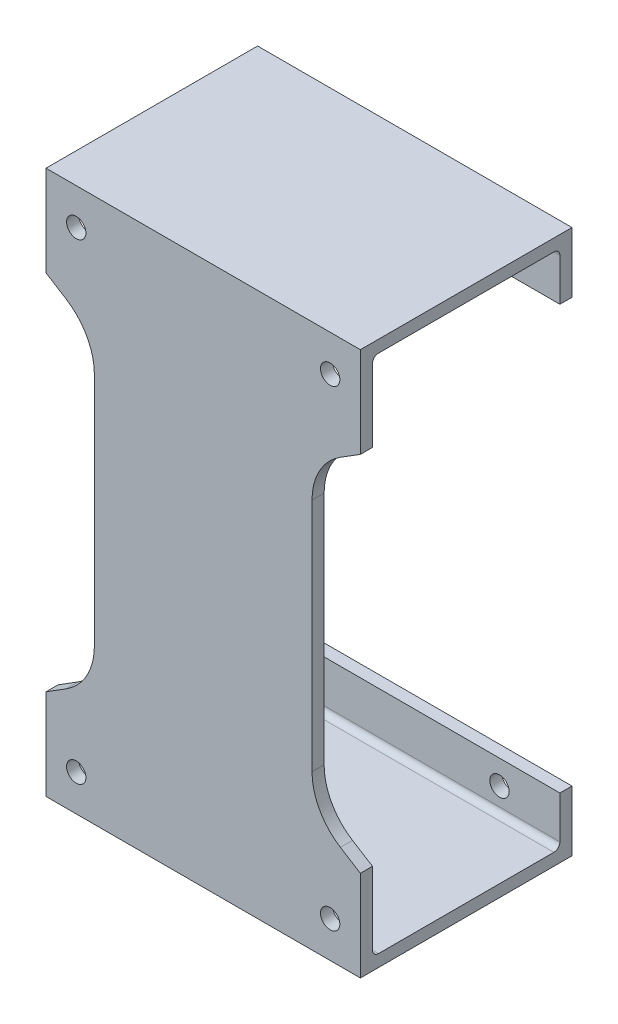
ISO-10303-21;
HEADER;
FILE_DESCRIPTION(('STEP AP214'),'2;1');
FILE_NAME('part.step','',(''),(''),'','','');
FILE_SCHEMA(('AUTOMOTIVE_DESIGN { 1 0 10303 214 1 1 1 1 }'));
ENDSEC;
DATA;
#1=APPLICATION_CONTEXT('core data for automotive mechanical design processes');
#2=APPLICATION_PROTOCOL_DEFINITION('international standard','automotive_design',2000,#1);
#3=PRODUCT_CONTEXT('',#1,'mechanical');
#4=PRODUCT('Part','Part','',(#3));
#5=PRODUCT_RELATED_PRODUCT_CATEGORY('part','',(#4));
#6=PRODUCT_DEFINITION_FORMATION('','',#4);
#7=PRODUCT_DEFINITION_CONTEXT('part definition',#1,'design');
#8=PRODUCT_DEFINITION('design','',#6,#7);
#9=PRODUCT_DEFINITION_SHAPE('','',#8);
#10=(LENGTH_UNIT() NAMED_UNIT(*) SI_UNIT(.MILLI.,.METRE.));
#11=(NAMED_UNIT(*) PLANE_ANGLE_UNIT() SI_UNIT($,.RADIAN.));
#12=(NAMED_UNIT(*) SI_UNIT($,.STERADIAN.) SOLID_ANGLE_UNIT());
#13=UNCERTAINTY_MEASURE_WITH_UNIT(LENGTH_MEASURE(1.E-05),#10,'distance_accuracy_value','');
#14=(GEOMETRIC_REPRESENTATION_CONTEXT(3) GLOBAL_UNCERTAINTY_ASSIGNED_CONTEXT((#13)) GLOBAL_UNIT_ASSIGNED_CONTEXT((#10,
#11,#12)) REPRESENTATION_CONTEXT('',''));
#15=CARTESIAN_POINT('',(0.,0.,0.));
#16=DIRECTION('',(0.,0.,1.));
#17=DIRECTION('',(1.,0.,0.));
#18=AXIS2_PLACEMENT_3D('',#15,#16,#17);
#19=CARTESIAN_POINT('',(26.,0.,0.));
#20=DIRECTION('',(1.,0.,0.));
#21=DIRECTION('',(0.,0.,-1.));
#22=AXIS2_PLACEMENT_3D('',#19,#20,#21);
#23=PLANE('',#22);
#24=DIRECTION('',(0.,0.,1.));
#25=VECTOR('',#24,1.);
#26=CARTESIAN_POINT('',(26.,-29.9999999999999,-35.001));
#27=LINE('',#26,#25);
#28=CARTESIAN_POINT('',(26.,-29.9999999999999,-2.));
#29=VERTEX_POINT('',#28);
#30=CARTESIAN_POINT('',(26.,-29.9999999999999,0.));
#31=VERTEX_POINT('',#30);
#32=EDGE_CURVE('E228',#29,#31,#27,.T.);
#33=ORIENTED_EDGE('',*,*,#32,.T.);
#34=DIRECTION('',(0.,-1.,0.));
#35=VECTOR('',#34,1.);
#36=CARTESIAN_POINT('',(26.,-45.,0.));
#37=LINE('',#36,#35);
#38=CARTESIAN_POINT('',(26.,-45.,0.));
#39=VERTEX_POINT('',#38);
#40=EDGE_CURVE('E247',#31,#39,#37,.T.);
#41=ORIENTED_EDGE('',*,*,#40,.T.);
#42=DIRECTION('',(0.,0.,-1.));
#43=VECTOR('',#42,1.);
#44=CARTESIAN_POINT('',(26.,-45.,0.));
#45=LINE('',#44,#43);
#46=CARTESIAN_POINT('',(26.,-45.,-35.));
#47=VERTEX_POINT('',#46);
#48=EDGE_CURVE('E287',#39,#47,#45,.T.);
#49=ORIENTED_EDGE('',*,*,#48,.T.);
#50=DIRECTION('',(0.,1.,0.));
#51=VECTOR('',#50,1.);
#52=CARTESIAN_POINT('',(26.,-45.,-35.));
#53=LINE('',#52,#51);
#54=CARTESIAN_POINT('',(26.,-35.,-35.));
#55=VERTEX_POINT('',#54);
#56=EDGE_CURVE('E454',#47,#55,#53,.T.);
#57=ORIENTED_EDGE('',*,*,#56,.T.);
#58=DIRECTION('',(0.,0.,1.));
#59=VECTOR('',#58,1.);
#60=CARTESIAN_POINT('',(26.,-35.,-33.));
#61=LINE('',#60,#59);
#62=CARTESIAN_POINT('',(26.,-35.,-33.));
#63=VERTEX_POINT('',#62);
#64=EDGE_CURVE('E456',#55,#63,#61,.T.);
#65=ORIENTED_EDGE('',*,*,#64,.T.);
#66=DIRECTION('',(0.,-1.,0.));
#67=VECTOR('',#66,1.);
#68=CARTESIAN_POINT('',(26.,-43.,-33.));
#69=LINE('',#68,#67);
#70=CARTESIAN_POINT('',(26.,-42.,-33.));
#71=VERTEX_POINT('',#70);
#72=EDGE_CURVE('E458',#63,#71,#69,.T.);
#73=ORIENTED_EDGE('',*,*,#72,.T.);
#74=CARTESIAN_POINT('',(26.,-42.,-32.));
#75=DIRECTION('',(1.,0.,0.));
#76=DIRECTION('',(0.,0.,-1.));
#77=AXIS2_PLACEMENT_3D('',#74,#75,#76);
#78=CIRCLE('',#77,1.);
#79=CARTESIAN_POINT('',(26.,-43.,-32.));
#80=VERTEX_POINT('',#79);
#81=EDGE_CURVE('E331',#71,#80,#78,.F.);
#82=ORIENTED_EDGE('',*,*,#81,.T.);
#83=DIRECTION('',(0.,0.,1.));
#84=VECTOR('',#83,1.);
#85=CARTESIAN_POINT('',(26.,-43.,-2.));
#86=LINE('',#85,#84);
#87=CARTESIAN_POINT('',(26.,-43.,-3.));
#88=VERTEX_POINT('',#87);
#89=EDGE_CURVE('E461',#80,#88,#86,.T.);
#90=ORIENTED_EDGE('',*,*,#89,.T.);
#91=CARTESIAN_POINT('',(26.,-42.,-3.));
#92=DIRECTION('',(1.,0.,0.));
#93=DIRECTION('',(0.,0.,-1.));
#94=AXIS2_PLACEMENT_3D('',#91,#92,#93);
#95=CIRCLE('',#94,1.);
#96=CARTESIAN_POINT('',(26.,-42.,-2.));
#97=VERTEX_POINT('',#96);
#98=EDGE_CURVE('E339',#88,#97,#95,.F.);
#99=ORIENTED_EDGE('',*,*,#98,.T.);
#100=DIRECTION('',(0.,1.,0.));
#101=VECTOR('',#100,1.);
#102=CARTESIAN_POINT('',(26.,-43.,-2.));
#103=LINE('',#102,#101);
#104=EDGE_CURVE('E465',#97,#29,#103,.T.);
#105=ORIENTED_EDGE('',*,*,#104,.T.);
#106=EDGE_LOOP('',(#33,#41,#49,#57,#65,#73,#82,#90,#99,#105));
#107=FACE_BOUND('',#106,.T.);
#108=ADVANCED_FACE('F33',(#107),#23,.T.);
#109=CARTESIAN_POINT('',(-26.,0.,0.));
#110=DIRECTION('',(1.,0.,0.));
#111=DIRECTION('',(0.,0.,-1.));
#112=AXIS2_PLACEMENT_3D('',#109,#110,#111);
#113=PLANE('',#112);
#114=DIRECTION('',(0.,1.,0.));
#115=VECTOR('',#114,1.);
#116=CARTESIAN_POINT('',(-26.,-43.,-2.));
#117=LINE('',#116,#115);
#118=CARTESIAN_POINT('',(-26.,30.,-2.));
#119=VERTEX_POINT('',#118);
#120=CARTESIAN_POINT('',(-26.,42.,-2.));
#121=VERTEX_POINT('',#120);
#122=EDGE_CURVE('E269',#119,#121,#117,.T.);
#123=ORIENTED_EDGE('',*,*,#122,.F.);
#124=DIRECTION('',(0.,0.,1.));
#125=VECTOR('',#124,1.);
#126=CARTESIAN_POINT('',(-26.,30.,-35.001));
#127=LINE('',#126,#125);
#128=CARTESIAN_POINT('',(-26.,30.,0.));
#129=VERTEX_POINT('',#128);
#130=EDGE_CURVE('E390',#119,#129,#127,.T.);
#131=ORIENTED_EDGE('',*,*,#130,.T.);
#132=DIRECTION('',(0.,-1.,0.));
#133=VECTOR('',#132,1.);
#134=CARTESIAN_POINT('',(-26.,-45.,0.));
#135=LINE('',#134,#133);
#136=CARTESIAN_POINT('',(-26.,45.,0.));
#137=VERTEX_POINT('',#136);
#138=EDGE_CURVE('E285',#137,#129,#135,.T.);
#139=ORIENTED_EDGE('',*,*,#138,.F.);
#140=DIRECTION('',(0.,0.,1.));
#141=VECTOR('',#140,1.);
#142=CARTESIAN_POINT('',(-26.,45.,0.));
#143=LINE('',#142,#141);
#144=CARTESIAN_POINT('',(-26.,45.,-35.));
#145=VERTEX_POINT('',#144);
#146=EDGE_CURVE('E282',#145,#137,#143,.T.);
#147=ORIENTED_EDGE('',*,*,#146,.F.);
#148=DIRECTION('',(0.,1.,0.));
#149=VECTOR('',#148,1.);
#150=CARTESIAN_POINT('',(-26.,45.,-35.));
#151=LINE('',#150,#149);
#152=CARTESIAN_POINT('',(-26.,35.,-35.));
#153=VERTEX_POINT('',#152);
#154=EDGE_CURVE('E280',#153,#145,#151,.T.);
#155=ORIENTED_EDGE('',*,*,#154,.F.);
#156=DIRECTION('',(0.,0.,-1.));
#157=VECTOR('',#156,1.);
#158=CARTESIAN_POINT('',(-26.,35.,-33.));
#159=LINE('',#158,#157);
#160=CARTESIAN_POINT('',(-26.,35.,-33.));
#161=VERTEX_POINT('',#160);
#162=EDGE_CURVE('E278',#161,#153,#159,.T.);
#163=ORIENTED_EDGE('',*,*,#162,.F.);
#164=DIRECTION('',(0.,-1.,0.));
#165=VECTOR('',#164,1.);
#166=CARTESIAN_POINT('',(-26.,43.,-33.));
#167=LINE('',#166,#165);
#168=CARTESIAN_POINT('',(-26.,42.,-33.));
#169=VERTEX_POINT('',#168);
#170=EDGE_CURVE('E276',#169,#161,#167,.T.);
#171=ORIENTED_EDGE('',*,*,#170,.F.);
#172=CARTESIAN_POINT('',(-26.,42.,-32.));
#173=DIRECTION('',(1.,0.,0.));
#174=DIRECTION('',(0.,0.,-1.));
#175=AXIS2_PLACEMENT_3D('',#172,#173,#174);
#176=CIRCLE('',#175,1.);
#177=CARTESIAN_POINT('',(-26.,43.,-32.));
#178=VERTEX_POINT('',#177);
#179=EDGE_CURVE('E333',#169,#178,#176,.T.);
#180=ORIENTED_EDGE('',*,*,#179,.T.);
#181=DIRECTION('',(0.,0.,-1.));
#182=VECTOR('',#181,1.);
#183=CARTESIAN_POINT('',(-26.,43.,-2.));
#184=LINE('',#183,#182);
#185=CARTESIAN_POINT('',(-26.,43.,-3.));
#186=VERTEX_POINT('',#185);
#187=EDGE_CURVE('E273',#186,#178,#184,.T.);
#188=ORIENTED_EDGE('',*,*,#187,.F.);
#189=CARTESIAN_POINT('',(-26.,42.,-3.));
#190=DIRECTION('',(1.,0.,0.));
#191=DIRECTION('',(0.,0.,-1.));
#192=AXIS2_PLACEMENT_3D('',#189,#190,#191);
#193=CIRCLE('',#192,1.);
#194=EDGE_CURVE('E341',#186,#121,#193,.T.);
#195=ORIENTED_EDGE('',*,*,#194,.T.);
#196=EDGE_LOOP('',(#123,#131,#139,#147,#155,#163,#171,#180,#188,#195));
#197=FACE_BOUND('',#196,.T.);
#198=ADVANCED_FACE('F487',(#197),#113,.F.);
#199=CARTESIAN_POINT('',(26.,-45.,0.));
#200=DIRECTION('',(0.,1.,0.));
#201=DIRECTION('',(0.,0.,1.));
#202=AXIS2_PLACEMENT_3D('',#199,#200,#201);
#203=PLANE('',#202);
#204=DIRECTION('',(0.,0.,-1.));
#205=VECTOR('',#204,1.);
#206=CARTESIAN_POINT('',(-26.,-45.,0.));
#207=LINE('',#206,#205);
#208=CARTESIAN_POINT('',(-26.,-45.,0.));
#209=VERTEX_POINT('',#208);
#210=CARTESIAN_POINT('',(-26.,-45.,-35.));
#211=VERTEX_POINT('',#210);
#212=EDGE_CURVE('E255',#209,#211,#207,.T.);
#213=ORIENTED_EDGE('',*,*,#212,.T.);
#214=DIRECTION('',(-1.,0.,0.));
#215=VECTOR('',#214,1.);
#216=CARTESIAN_POINT('',(26.,-45.,-35.));
#217=LINE('',#216,#215);
#218=EDGE_CURVE('E305',#47,#211,#217,.T.);
#219=ORIENTED_EDGE('',*,*,#218,.F.);
#220=ORIENTED_EDGE('',*,*,#48,.F.);
#221=DIRECTION('',(-1.,0.,0.));
#222=VECTOR('',#221,1.);
#223=CARTESIAN_POINT('',(26.,-45.,0.));
#224=LINE('',#223,#222);
#225=EDGE_CURVE('E246',#39,#209,#224,.T.);
#226=ORIENTED_EDGE('',*,*,#225,.T.);
#227=EDGE_LOOP('',(#213,#219,#220,#226));
#228=FACE_BOUND('',#227,.T.);
#229=ADVANCED_FACE('F528',(#228),#203,.F.);
#230=CARTESIAN_POINT('',(26.,-45.,-35.));
#231=DIRECTION('',(0.,0.,1.));
#232=DIRECTION('',(1.,0.,0.));
#233=AXIS2_PLACEMENT_3D('',#230,#231,#232);
#234=PLANE('',#233);
#235=CARTESIAN_POINT('',(-16.,-39.,-35.));
#236=DIRECTION('',(0.,0.,1.));
#237=DIRECTION('',(1.,0.,0.));
#238=AXIS2_PLACEMENT_3D('',#235,#236,#237);
#239=CIRCLE('',#238,1.6);
#240=CARTESIAN_POINT('',(-14.4,-39.,-35.));
#241=VERTEX_POINT('',#240);
#242=EDGE_CURVE('E409',#241,#241,#239,.F.);
#243=ORIENTED_EDGE('',*,*,#242,.F.);
#244=EDGE_LOOP('',(#243));
#245=FACE_BOUND('',#244,.T.);
#246=CARTESIAN_POINT('',(16.,-39.,-35.));
#247=DIRECTION('',(0.,0.,1.));
#248=DIRECTION('',(1.,0.,0.));
#249=AXIS2_PLACEMENT_3D('',#246,#247,#248);
#250=CIRCLE('',#249,1.6);
#251=CARTESIAN_POINT('',(17.6,-39.,-35.));
#252=VERTEX_POINT('',#251);
#253=EDGE_CURVE('E426',#252,#252,#250,.F.);
#254=ORIENTED_EDGE('',*,*,#253,.F.);
#255=EDGE_LOOP('',(#254));
#256=FACE_BOUND('',#255,.T.);
#257=DIRECTION('',(0.,1.,0.));
#258=VECTOR('',#257,1.);
#259=CARTESIAN_POINT('',(-26.,-45.,-35.));
#260=LINE('',#259,#258);
#261=CARTESIAN_POINT('',(-26.,-35.,-35.));
#262=VERTEX_POINT('',#261);
#263=EDGE_CURVE('E258',#211,#262,#260,.T.);
#264=ORIENTED_EDGE('',*,*,#263,.T.);
#265=DIRECTION('',(-1.,0.,0.));
#266=VECTOR('',#265,1.);
#267=CARTESIAN_POINT('',(26.,-35.,-35.));
#268=LINE('',#267,#266);
#269=EDGE_CURVE('E302',#55,#262,#268,.T.);
#270=ORIENTED_EDGE('',*,*,#269,.F.);
#271=ORIENTED_EDGE('',*,*,#56,.F.);
#272=ORIENTED_EDGE('',*,*,#218,.T.);
#273=EDGE_LOOP('',(#264,#270,#271,#272));
#274=FACE_BOUND('',#273,.T.);
#275=ADVANCED_FACE('F580',(#245,#256,#274),#234,.F.);
#276=CARTESIAN_POINT('',(26.,-35.,-33.));
#277=DIRECTION('',(0.,-1.,0.));
#278=DIRECTION('',(0.,0.,-1.));
#279=AXIS2_PLACEMENT_3D('',#276,#277,#278);
#280=PLANE('',#279);
#281=DIRECTION('',(0.,0.,1.));
#282=VECTOR('',#281,1.);
#283=CARTESIAN_POINT('',(-26.,-35.,-33.));
#284=LINE('',#283,#282);
#285=CARTESIAN_POINT('',(-26.,-35.,-33.));
#286=VERTEX_POINT('',#285);
#287=EDGE_CURVE('E261',#262,#286,#284,.T.);
#288=ORIENTED_EDGE('',*,*,#287,.T.);
#289=DIRECTION('',(-1.,0.,0.));
#290=VECTOR('',#289,1.);
#291=CARTESIAN_POINT('',(26.,-35.,-33.));
#292=LINE('',#291,#290);
#293=EDGE_CURVE('E299',#63,#286,#292,.T.);
#294=ORIENTED_EDGE('',*,*,#293,.F.);
#295=ORIENTED_EDGE('',*,*,#64,.F.);
#296=ORIENTED_EDGE('',*,*,#269,.T.);
#297=EDGE_LOOP('',(#288,#294,#295,#296));
#298=FACE_BOUND('',#297,.T.);
#299=ADVANCED_FACE('F576',(#298),#280,.F.);
#300=CARTESIAN_POINT('',(26.,-43.,-33.));
#301=DIRECTION('',(0.,0.,-1.));
#302=DIRECTION('',(-1.,0.,0.));
#303=AXIS2_PLACEMENT_3D('',#300,#301,#302);
#304=PLANE('',#303);
#305=CARTESIAN_POINT('',(-16.,-39.,-33.));
#306=DIRECTION('',(0.,0.,1.));
#307=DIRECTION('',(-1.,0.,0.));
#308=AXIS2_PLACEMENT_3D('',#305,#306,#307);
#309=CIRCLE('',#308,1.6);
#310=CARTESIAN_POINT('',(-17.6,-39.,-33.));
#311=VERTEX_POINT('',#310);
#312=EDGE_CURVE('E406',#311,#311,#309,.T.);
#313=ORIENTED_EDGE('',*,*,#312,.F.);
#314=EDGE_LOOP('',(#313));
#315=FACE_BOUND('',#314,.T.);
#316=CARTESIAN_POINT('',(16.,-39.,-33.));
#317=DIRECTION('',(0.,0.,1.));
#318=DIRECTION('',(1.,0.,0.));
#319=AXIS2_PLACEMENT_3D('',#316,#317,#318);
#320=CIRCLE('',#319,1.6);
#321=CARTESIAN_POINT('',(17.6,-39.,-33.));
#322=VERTEX_POINT('',#321);
#323=EDGE_CURVE('E413',#322,#322,#320,.T.);
#324=ORIENTED_EDGE('',*,*,#323,.F.);
#325=EDGE_LOOP('',(#324));
#326=FACE_BOUND('',#325,.T.);
#327=DIRECTION('',(0.,-1.,0.));
#328=VECTOR('',#327,1.);
#329=CARTESIAN_POINT('',(-26.,-43.,-33.));
#330=LINE('',#329,#328);
#331=CARTESIAN_POINT('',(-26.,-42.,-33.));
#332=VERTEX_POINT('',#331);
#333=EDGE_CURVE('E263',#286,#332,#330,.T.);
#334=ORIENTED_EDGE('',*,*,#333,.T.);
#335=DIRECTION('',(-1.,0.,0.));
#336=VECTOR('',#335,1.);
#337=CARTESIAN_POINT('',(26.,-42.,-33.));
#338=LINE('',#337,#336);
#339=EDGE_CURVE('E313',#332,#71,#338,.F.);
#340=ORIENTED_EDGE('',*,*,#339,.T.);
#341=ORIENTED_EDGE('',*,*,#72,.F.);
#342=ORIENTED_EDGE('',*,*,#293,.T.);
#343=EDGE_LOOP('',(#334,#340,#341,#342));
#344=FACE_BOUND('',#343,.T.);
#345=ADVANCED_FACE('F568',(#315,#326,#344),#304,.F.);
#346=CARTESIAN_POINT('',(26.,-43.,-2.));
#347=DIRECTION('',(0.,-1.,0.));
#348=DIRECTION('',(0.,0.,-1.));
#349=AXIS2_PLACEMENT_3D('',#346,#347,#348);
#350=PLANE('',#349);
#351=ORIENTED_EDGE('',*,*,#89,.F.);
#352=DIRECTION('',(-1.,0.,0.));
#353=VECTOR('',#352,1.);
#354=CARTESIAN_POINT('',(-26.,-43.,-32.));
#355=LINE('',#354,#353);
#356=CARTESIAN_POINT('',(-26.,-43.,-32.));
#357=VERTEX_POINT('',#356);
#358=EDGE_CURVE('E310',#80,#357,#355,.T.);
#359=ORIENTED_EDGE('',*,*,#358,.T.);
#360=DIRECTION('',(0.,0.,1.));
#361=VECTOR('',#360,1.);
#362=CARTESIAN_POINT('',(-26.,-43.,-2.));
#363=LINE('',#362,#361);
#364=CARTESIAN_POINT('',(-26.,-43.,-3.));
#365=VERTEX_POINT('',#364);
#366=EDGE_CURVE('E266',#357,#365,#363,.T.);
#367=ORIENTED_EDGE('',*,*,#366,.T.);
#368=DIRECTION('',(-1.,0.,0.));
#369=VECTOR('',#368,1.);
#370=CARTESIAN_POINT('',(26.,-43.,-3.));
#371=LINE('',#370,#369);
#372=EDGE_CURVE('E308',#365,#88,#371,.F.);
#373=ORIENTED_EDGE('',*,*,#372,.T.);
#374=EDGE_LOOP('',(#351,#359,#367,#373));
#375=FACE_BOUND('',#374,.T.);
#376=ADVANCED_FACE('F560',(#375),#350,.F.);
#377=CARTESIAN_POINT('',(26.,-43.,-2.));
#378=DIRECTION('',(0.,0.,1.));
#379=DIRECTION('',(1.,0.,0.));
#380=AXIS2_PLACEMENT_3D('',#377,#378,#379);
#381=PLANE('',#380);
#382=CARTESIAN_POINT('',(-21.,39.,-2.));
#383=DIRECTION('',(0.,0.,1.));
#384=DIRECTION('',(1.,0.,0.));
#385=AXIS2_PLACEMENT_3D('',#382,#383,#384);
#386=CIRCLE('',#385,1.6);
#387=CARTESIAN_POINT('',(-19.4,39.,-2.));
#388=VERTEX_POINT('',#387);
#389=EDGE_CURVE('E430',#388,#388,#386,.F.);
#390=ORIENTED_EDGE('',*,*,#389,.F.);
#391=EDGE_LOOP('',(#390));
#392=FACE_BOUND('',#391,.T.);
#393=CARTESIAN_POINT('',(21.,39.,-2.));
#394=DIRECTION('',(0.,0.,1.));
#395=DIRECTION('',(1.,0.,0.));
#396=AXIS2_PLACEMENT_3D('',#393,#394,#395);
#397=CIRCLE('',#396,1.6);
#398=CARTESIAN_POINT('',(22.6,39.,-2.));
#399=VERTEX_POINT('',#398);
#400=EDGE_CURVE('E437',#399,#399,#397,.F.);
#401=ORIENTED_EDGE('',*,*,#400,.F.);
#402=EDGE_LOOP('',(#401));
#403=FACE_BOUND('',#402,.T.);
#404=CARTESIAN_POINT('',(21.,-39.,-2.));
#405=DIRECTION('',(0.,0.,1.));
#406=DIRECTION('',(1.,0.,0.));
#407=AXIS2_PLACEMENT_3D('',#404,#405,#406);
#408=CIRCLE('',#407,1.6);
#409=CARTESIAN_POINT('',(22.6,-39.,-2.));
#410=VERTEX_POINT('',#409);
#411=EDGE_CURVE('E429',#410,#410,#408,.F.);
#412=ORIENTED_EDGE('',*,*,#411,.F.);
#413=EDGE_LOOP('',(#412));
#414=FACE_BOUND('',#413,.T.);
#415=CARTESIAN_POINT('',(-21.,-39.,-2.));
#416=DIRECTION('',(0.,0.,1.));
#417=DIRECTION('',(1.,0.,0.));
#418=AXIS2_PLACEMENT_3D('',#415,#416,#417);
#419=CIRCLE('',#418,1.6);
#420=CARTESIAN_POINT('',(-19.4,-39.,-2.));
#421=VERTEX_POINT('',#420);
#422=EDGE_CURVE('E433',#421,#421,#419,.F.);
#423=ORIENTED_EDGE('',*,*,#422,.F.);
#424=EDGE_LOOP('',(#423));
#425=FACE_BOUND('',#424,.T.);
#426=DIRECTION('',(0.,1.,0.));
#427=VECTOR('',#426,1.);
#428=CARTESIAN_POINT('',(18.,25.,-2.));
#429=LINE('',#428,#427);
#430=CARTESIAN_POINT('',(18.,-19.4575235849292,-2.));
#431=VERTEX_POINT('',#430);
#432=CARTESIAN_POINT('',(18.,19.4575235849293,-2.));
#433=VERTEX_POINT('',#432);
#434=EDGE_CURVE('E637',#431,#433,#429,.T.);
#435=ORIENTED_EDGE('',*,*,#434,.F.);
#436=CARTESIAN_POINT('',(28.,-19.4575235849292,-2.));
#437=DIRECTION('',(0.,0.,1.));
#438=DIRECTION('',(1.,0.,0.));
#439=AXIS2_PLACEMENT_3D('',#436,#437,#438);
#440=CIRCLE('',#439,10.);
#441=CARTESIAN_POINT('',(22.7000105999682,-27.9375066249801,-2.));
#442=VERTEX_POINT('',#441);
#443=EDGE_CURVE('E367',#431,#442,#440,.T.);
#444=ORIENTED_EDGE('',*,*,#443,.T.);
#445=DIRECTION('',(-0.847998304005088,0.52999894000318,0.));
#446=VECTOR('',#445,1.);
#447=CARTESIAN_POINT('',(26.,-29.9999999999999,-2.));
#448=LINE('',#447,#446);
#449=EDGE_CURVE('E240',#29,#442,#448,.T.);
#450=ORIENTED_EDGE('',*,*,#449,.F.);
#451=ORIENTED_EDGE('',*,*,#104,.F.);
#452=DIRECTION('',(-1.,0.,0.));
#453=VECTOR('',#452,1.);
#454=CARTESIAN_POINT('',(-26.,-42.,-2.));
#455=LINE('',#454,#453);
#456=CARTESIAN_POINT('',(-26.,-42.,-2.));
#457=VERTEX_POINT('',#456);
#458=EDGE_CURVE('E326',#97,#457,#455,.T.);
#459=ORIENTED_EDGE('',*,*,#458,.T.);
#460=CARTESIAN_POINT('',(-26.,-30.,-2.));
#461=VERTEX_POINT('',#460);
#462=EDGE_CURVE('E270',#457,#461,#117,.T.);
#463=ORIENTED_EDGE('',*,*,#462,.T.);
#464=DIRECTION('',(-0.847998304005088,-0.52999894000318,0.));
#465=VECTOR('',#464,1.);
#466=CARTESIAN_POINT('',(-26.,-30.,-2.));
#467=LINE('',#466,#465);
#468=CARTESIAN_POINT('',(-22.7000105999682,-27.9375066249801,-2.));
#469=VERTEX_POINT('',#468);
#470=EDGE_CURVE('E402',#469,#461,#467,.T.);
#471=ORIENTED_EDGE('',*,*,#470,.F.);
#472=CARTESIAN_POINT('',(-28.,-19.4575235849293,-2.));
#473=DIRECTION('',(0.,0.,1.));
#474=DIRECTION('',(1.,0.,0.));
#475=AXIS2_PLACEMENT_3D('',#472,#473,#474);
#476=CIRCLE('',#475,10.);
#477=CARTESIAN_POINT('',(-18.,-19.4575235849293,-2.));
#478=VERTEX_POINT('',#477);
#479=EDGE_CURVE('E374',#469,#478,#476,.T.);
#480=ORIENTED_EDGE('',*,*,#479,.T.);
#481=DIRECTION('',(0.,-1.,0.));
#482=VECTOR('',#481,1.);
#483=CARTESIAN_POINT('',(-18.,25.,-2.));
#484=LINE('',#483,#482);
#485=CARTESIAN_POINT('',(-18.,19.4575235849293,-2.));
#486=VERTEX_POINT('',#485);
#487=EDGE_CURVE('E392',#486,#478,#484,.T.);
#488=ORIENTED_EDGE('',*,*,#487,.F.);
#489=CARTESIAN_POINT('',(-28.,19.4575235849293,-2.));
#490=DIRECTION('',(0.,0.,1.));
#491=DIRECTION('',(1.,0.,0.));
#492=AXIS2_PLACEMENT_3D('',#489,#490,#491);
#493=CIRCLE('',#492,10.);
#494=CARTESIAN_POINT('',(-22.7000105999682,27.9375066249801,-2.));
#495=VERTEX_POINT('',#494);
#496=EDGE_CURVE('E11',#486,#495,#493,.T.);
#497=ORIENTED_EDGE('',*,*,#496,.T.);
#498=DIRECTION('',(0.847998304005088,-0.52999894000318,0.));
#499=VECTOR('',#498,1.);
#500=CARTESIAN_POINT('',(-26.,30.,-2.));
#501=LINE('',#500,#499);
#502=EDGE_CURVE('E389',#119,#495,#501,.T.);
#503=ORIENTED_EDGE('',*,*,#502,.F.);
#504=ORIENTED_EDGE('',*,*,#122,.T.);
#505=DIRECTION('',(-1.,0.,0.));
#506=VECTOR('',#505,1.);
#507=CARTESIAN_POINT('',(26.,42.,-2.));
#508=LINE('',#507,#506);
#509=CARTESIAN_POINT('',(26.,42.,-2.));
#510=VERTEX_POINT('',#509);
#511=EDGE_CURVE('E323',#121,#510,#508,.F.);
#512=ORIENTED_EDGE('',*,*,#511,.T.);
#513=CARTESIAN_POINT('',(26.,30.,-2.));
#514=VERTEX_POINT('',#513);
#515=EDGE_CURVE('E464',#514,#510,#103,.T.);
#516=ORIENTED_EDGE('',*,*,#515,.F.);
#517=DIRECTION('',(0.847998304005088,0.52999894000318,0.));
#518=VECTOR('',#517,1.);
#519=CARTESIAN_POINT('',(26.,30.,-2.));
#520=LINE('',#519,#518);
#521=CARTESIAN_POINT('',(22.7000105999682,27.9375066249801,-2.));
#522=VERTEX_POINT('',#521);
#523=EDGE_CURVE('E224',#522,#514,#520,.T.);
#524=ORIENTED_EDGE('',*,*,#523,.F.);
#525=CARTESIAN_POINT('',(28.,19.4575235849293,-2.));
#526=DIRECTION('',(0.,0.,1.));
#527=DIRECTION('',(1.,0.,0.));
#528=AXIS2_PLACEMENT_3D('',#525,#526,#527);
#529=CIRCLE('',#528,10.);
#530=EDGE_CURVE('E370',#522,#433,#529,.T.);
#531=ORIENTED_EDGE('',*,*,#530,.T.);
#532=EDGE_LOOP('',(#435,#444,#450,#451,#459,#463,#471,#480,#488,#497,#503,#504,#512,#516,#524,#531));
#533=FACE_BOUND('',#532,.T.);
#534=ADVANCED_FACE('F491',(#392,#403,#414,#425,#533),#381,.F.);
#535=CARTESIAN_POINT('',(26.,43.,-2.));
#536=DIRECTION('',(0.,1.,0.));
#537=DIRECTION('',(0.,0.,1.));
#538=AXIS2_PLACEMENT_3D('',#535,#536,#537);
#539=PLANE('',#538);
#540=ORIENTED_EDGE('',*,*,#187,.T.);
#541=DIRECTION('',(-1.,0.,0.));
#542=VECTOR('',#541,1.);
#543=CARTESIAN_POINT('',(26.,43.,-32.));
#544=LINE('',#543,#542);
#545=CARTESIAN_POINT('',(26.,43.,-32.));
#546=VERTEX_POINT('',#545);
#547=EDGE_CURVE('E321',#178,#546,#544,.F.);
#548=ORIENTED_EDGE('',*,*,#547,.T.);
#549=DIRECTION('',(0.,0.,-1.));
#550=VECTOR('',#549,1.);
#551=CARTESIAN_POINT('',(26.,43.,-2.));
#552=LINE('',#551,#550);
#553=CARTESIAN_POINT('',(26.,43.,-3.));
#554=VERTEX_POINT('',#553);
#555=EDGE_CURVE('E468',#554,#546,#552,.T.);
#556=ORIENTED_EDGE('',*,*,#555,.F.);
#557=DIRECTION('',(-1.,0.,0.));
#558=VECTOR('',#557,1.);
#559=CARTESIAN_POINT('',(-26.,43.,-3.));
#560=LINE('',#559,#558);
#561=EDGE_CURVE('E318',#554,#186,#560,.T.);
#562=ORIENTED_EDGE('',*,*,#561,.T.);
#563=EDGE_LOOP('',(#540,#548,#556,#562));
#564=FACE_BOUND('',#563,.T.);
#565=ADVANCED_FACE('F499',(#564),#539,.F.);
#566=CARTESIAN_POINT('',(26.,43.,-33.));
#567=DIRECTION('',(0.,0.,-1.));
#568=DIRECTION('',(-1.,0.,0.));
#569=AXIS2_PLACEMENT_3D('',#566,#567,#568);
#570=PLANE('',#569);
#571=CARTESIAN_POINT('',(-16.,39.,-33.));
#572=DIRECTION('',(0.,0.,1.));
#573=DIRECTION('',(1.,0.,0.));
#574=AXIS2_PLACEMENT_3D('',#571,#572,#573);
#575=CIRCLE('',#574,1.6);
#576=CARTESIAN_POINT('',(-14.4,39.,-33.));
#577=VERTEX_POINT('',#576);
#578=EDGE_CURVE('E414',#577,#577,#575,.T.);
#579=ORIENTED_EDGE('',*,*,#578,.F.);
#580=EDGE_LOOP('',(#579));
#581=FACE_BOUND('',#580,.T.);
#582=CARTESIAN_POINT('',(16.,39.,-33.));
#583=DIRECTION('',(0.,0.,1.));
#584=DIRECTION('',(-1.,0.,0.));
#585=AXIS2_PLACEMENT_3D('',#582,#583,#584);
#586=CIRCLE('',#585,1.6);
#587=CARTESIAN_POINT('',(14.4,39.,-33.));
#588=VERTEX_POINT('',#587);
#589=EDGE_CURVE('E405',#588,#588,#586,.T.);
#590=ORIENTED_EDGE('',*,*,#589,.F.);
#591=EDGE_LOOP('',(#590));
#592=FACE_BOUND('',#591,.T.);
#593=DIRECTION('',(0.,-1.,0.));
#594=VECTOR('',#593,1.);
#595=CARTESIAN_POINT('',(26.,43.,-33.));
#596=LINE('',#595,#594);
#597=CARTESIAN_POINT('',(26.,42.,-33.));
#598=VERTEX_POINT('',#597);
#599=CARTESIAN_POINT('',(26.,35.,-33.));
#600=VERTEX_POINT('',#599);
#601=EDGE_CURVE('E471',#598,#600,#596,.T.);
#602=ORIENTED_EDGE('',*,*,#601,.F.);
#603=DIRECTION('',(-1.,0.,0.));
#604=VECTOR('',#603,1.);
#605=CARTESIAN_POINT('',(-26.,42.,-33.));
#606=LINE('',#605,#604);
#607=EDGE_CURVE('E315',#598,#169,#606,.T.);
#608=ORIENTED_EDGE('',*,*,#607,.T.);
#609=ORIENTED_EDGE('',*,*,#170,.T.);
#610=DIRECTION('',(-1.,0.,0.));
#611=VECTOR('',#610,1.);
#612=CARTESIAN_POINT('',(26.,35.,-33.));
#613=LINE('',#612,#611);
#614=EDGE_CURVE('E296',#600,#161,#613,.T.);
#615=ORIENTED_EDGE('',*,*,#614,.F.);
#616=EDGE_LOOP('',(#602,#608,#609,#615));
#617=FACE_BOUND('',#616,.T.);
#618=ADVANCED_FACE('F507',(#581,#592,#617),#570,.F.);
#619=CARTESIAN_POINT('',(26.,35.,-33.));
#620=DIRECTION('',(0.,1.,0.));
#621=DIRECTION('',(0.,0.,1.));
#622=AXIS2_PLACEMENT_3D('',#619,#620,#621);
#623=PLANE('',#622);
#624=ORIENTED_EDGE('',*,*,#162,.T.);
#625=DIRECTION('',(-1.,0.,0.));
#626=VECTOR('',#625,1.);
#627=CARTESIAN_POINT('',(26.,35.,-35.));
#628=LINE('',#627,#626);
#629=CARTESIAN_POINT('',(26.,35.,-35.));
#630=VERTEX_POINT('',#629);
#631=EDGE_CURVE('E293',#630,#153,#628,.T.);
#632=ORIENTED_EDGE('',*,*,#631,.F.);
#633=DIRECTION('',(0.,0.,-1.));
#634=VECTOR('',#633,1.);
#635=CARTESIAN_POINT('',(26.,35.,-33.));
#636=LINE('',#635,#634);
#637=EDGE_CURVE('E473',#600,#630,#636,.T.);
#638=ORIENTED_EDGE('',*,*,#637,.F.);
#639=ORIENTED_EDGE('',*,*,#614,.T.);
#640=EDGE_LOOP('',(#624,#632,#638,#639));
#641=FACE_BOUND('',#640,.T.);
#642=ADVANCED_FACE('F511',(#641),#623,.F.);
#643=CARTESIAN_POINT('',(26.,45.,-35.));
#644=DIRECTION('',(0.,0.,1.));
#645=DIRECTION('',(1.,0.,0.));
#646=AXIS2_PLACEMENT_3D('',#643,#644,#645);
#647=PLANE('',#646);
#648=CARTESIAN_POINT('',(-16.,39.,-35.));
#649=DIRECTION('',(0.,0.,1.));
#650=DIRECTION('',(1.,0.,0.));
#651=AXIS2_PLACEMENT_3D('',#648,#649,#650);
#652=CIRCLE('',#651,1.6);
#653=CARTESIAN_POINT('',(-14.4,39.,-35.));
#654=VERTEX_POINT('',#653);
#655=EDGE_CURVE('E410',#654,#654,#652,.F.);
#656=ORIENTED_EDGE('',*,*,#655,.F.);
#657=EDGE_LOOP('',(#656));
#658=FACE_BOUND('',#657,.T.);
#659=CARTESIAN_POINT('',(16.,39.,-35.));
#660=DIRECTION('',(0.,0.,1.));
#661=DIRECTION('',(1.,0.,0.));
#662=AXIS2_PLACEMENT_3D('',#659,#660,#661);
#663=CIRCLE('',#662,1.6);
#664=CARTESIAN_POINT('',(17.6,39.,-35.));
#665=VERTEX_POINT('',#664);
#666=EDGE_CURVE('E417',#665,#665,#663,.F.);
#667=ORIENTED_EDGE('',*,*,#666,.F.);
#668=EDGE_LOOP('',(#667));
#669=FACE_BOUND('',#668,.T.);
#670=ORIENTED_EDGE('',*,*,#154,.T.);
#671=DIRECTION('',(-1.,0.,0.));
#672=VECTOR('',#671,1.);
#673=CARTESIAN_POINT('',(26.,45.,-35.));
#674=LINE('',#673,#672);
#675=CARTESIAN_POINT('',(26.,45.,-35.));
#676=VERTEX_POINT('',#675);
#677=EDGE_CURVE('E290',#676,#145,#674,.T.);
#678=ORIENTED_EDGE('',*,*,#677,.F.);
#679=DIRECTION('',(0.,1.,0.));
#680=VECTOR('',#679,1.);
#681=CARTESIAN_POINT('',(26.,45.,-35.));
#682=LINE('',#681,#680);
#683=EDGE_CURVE('E474',#630,#676,#682,.T.);
#684=ORIENTED_EDGE('',*,*,#683,.F.);
#685=ORIENTED_EDGE('',*,*,#631,.T.);
#686=EDGE_LOOP('',(#670,#678,#684,#685));
#687=FACE_BOUND('',#686,.T.);
#688=ADVANCED_FACE('F480',(#658,#669,#687),#647,.F.);
#689=CARTESIAN_POINT('',(26.,45.,0.));
#690=DIRECTION('',(0.,-1.,0.));
#691=DIRECTION('',(0.,0.,-1.));
#692=AXIS2_PLACEMENT_3D('',#689,#690,#691);
#693=PLANE('',#692);
#694=ORIENTED_EDGE('',*,*,#146,.T.);
#695=DIRECTION('',(-1.,0.,0.));
#696=VECTOR('',#695,1.);
#697=CARTESIAN_POINT('',(26.,45.,0.));
#698=LINE('',#697,#696);
#699=CARTESIAN_POINT('',(26.,45.,0.));
#700=VERTEX_POINT('',#699);
#701=EDGE_CURVE('E250',#700,#137,#698,.T.);
#702=ORIENTED_EDGE('',*,*,#701,.F.);
#703=DIRECTION('',(0.,0.,1.));
#704=VECTOR('',#703,1.);
#705=CARTESIAN_POINT('',(26.,45.,0.));
#706=LINE('',#705,#704);
#707=EDGE_CURVE('E244',#676,#700,#706,.T.);
#708=ORIENTED_EDGE('',*,*,#707,.F.);
#709=ORIENTED_EDGE('',*,*,#677,.T.);
#710=EDGE_LOOP('',(#694,#702,#708,#709));
#711=FACE_BOUND('',#710,.T.);
#712=ADVANCED_FACE('F484',(#711),#693,.F.);
#713=CARTESIAN_POINT('',(26.,-45.,0.));
#714=DIRECTION('',(0.,0.,-1.));
#715=DIRECTION('',(-1.,0.,0.));
#716=AXIS2_PLACEMENT_3D('',#713,#714,#715);
#717=PLANE('',#716);
#718=CARTESIAN_POINT('',(-21.,39.,0.));
#719=DIRECTION('',(0.,0.,1.));
#720=DIRECTION('',(-1.,0.,0.));
#721=AXIS2_PLACEMENT_3D('',#718,#719,#720);
#722=CIRCLE('',#721,1.6);
#723=CARTESIAN_POINT('',(-22.6,39.,0.));
#724=VERTEX_POINT('',#723);
#725=EDGE_CURVE('E434',#724,#724,#722,.T.);
#726=ORIENTED_EDGE('',*,*,#725,.F.);
#727=EDGE_LOOP('',(#726));
#728=FACE_BOUND('',#727,.T.);
#729=CARTESIAN_POINT('',(21.,39.,0.));
#730=DIRECTION('',(0.,0.,1.));
#731=DIRECTION('',(1.,0.,0.));
#732=AXIS2_PLACEMENT_3D('',#729,#730,#731);
#733=CIRCLE('',#732,1.6);
#734=CARTESIAN_POINT('',(22.6,39.,0.));
#735=VERTEX_POINT('',#734);
#736=EDGE_CURVE('E440',#735,#735,#733,.T.);
#737=ORIENTED_EDGE('',*,*,#736,.F.);
#738=EDGE_LOOP('',(#737));
#739=FACE_BOUND('',#738,.T.);
#740=CARTESIAN_POINT('',(21.,-39.,0.));
#741=DIRECTION('',(0.,0.,1.));
#742=DIRECTION('',(-1.,0.,0.));
#743=AXIS2_PLACEMENT_3D('',#740,#741,#742);
#744=CIRCLE('',#743,1.6);
#745=CARTESIAN_POINT('',(19.4,-39.,0.));
#746=VERTEX_POINT('',#745);
#747=EDGE_CURVE('E443',#746,#746,#744,.T.);
#748=ORIENTED_EDGE('',*,*,#747,.F.);
#749=EDGE_LOOP('',(#748));
#750=FACE_BOUND('',#749,.T.);
#751=CARTESIAN_POINT('',(-21.,-39.,0.));
#752=DIRECTION('',(0.,0.,1.));
#753=DIRECTION('',(1.,0.,0.));
#754=AXIS2_PLACEMENT_3D('',#751,#752,#753);
#755=CIRCLE('',#754,1.6);
#756=CARTESIAN_POINT('',(-19.4,-39.,0.));
#757=VERTEX_POINT('',#756);
#758=EDGE_CURVE('E259',#757,#757,#755,.T.);
#759=ORIENTED_EDGE('',*,*,#758,.F.);
#760=EDGE_LOOP('',(#759));
#761=FACE_BOUND('',#760,.T.);
#762=ORIENTED_EDGE('',*,*,#40,.F.);
#763=DIRECTION('',(0.847998304005088,-0.52999894000318,0.));
#764=VECTOR('',#763,1.);
#765=CARTESIAN_POINT('',(26.,-29.9999999999999,0.));
#766=LINE('',#765,#764);
#767=CARTESIAN_POINT('',(22.7000105999682,-27.9375066249801,0.));
#768=VERTEX_POINT('',#767);
#769=EDGE_CURVE('E229',#768,#31,#766,.T.);
#770=ORIENTED_EDGE('',*,*,#769,.F.);
#771=CARTESIAN_POINT('',(28.,-19.4575235849292,0.));
#772=DIRECTION('',(0.,0.,-1.));
#773=DIRECTION('',(-1.,0.,0.));
#774=AXIS2_PLACEMENT_3D('',#771,#772,#773);
#775=CIRCLE('',#774,10.);
#776=CARTESIAN_POINT('',(18.,-19.4575235849292,0.));
#777=VERTEX_POINT('',#776);
#778=EDGE_CURVE('E365',#768,#777,#775,.T.);
#779=ORIENTED_EDGE('',*,*,#778,.T.);
#780=DIRECTION('',(0.,-1.,0.));
#781=VECTOR('',#780,1.);
#782=CARTESIAN_POINT('',(18.,25.,0.));
#783=LINE('',#782,#781);
#784=CARTESIAN_POINT('',(18.,19.4575235849293,0.));
#785=VERTEX_POINT('',#784);
#786=EDGE_CURVE('E239',#785,#777,#783,.T.);
#787=ORIENTED_EDGE('',*,*,#786,.F.);
#788=CARTESIAN_POINT('',(28.,19.4575235849293,0.));
#789=DIRECTION('',(0.,0.,-1.));
#790=DIRECTION('',(-1.,0.,0.));
#791=AXIS2_PLACEMENT_3D('',#788,#789,#790);
#792=CIRCLE('',#791,10.);
#793=CARTESIAN_POINT('',(22.7000105999682,27.9375066249801,0.));
#794=VERTEX_POINT('',#793);
#795=EDGE_CURVE('E238',#785,#794,#792,.T.);
#796=ORIENTED_EDGE('',*,*,#795,.T.);
#797=DIRECTION('',(-0.847998304005088,-0.52999894000318,0.));
#798=VECTOR('',#797,1.);
#799=CARTESIAN_POINT('',(26.,30.,0.));
#800=LINE('',#799,#798);
#801=CARTESIAN_POINT('',(26.,30.,0.));
#802=VERTEX_POINT('',#801);
#803=EDGE_CURVE('E221',#802,#794,#800,.T.);
#804=ORIENTED_EDGE('',*,*,#803,.F.);
#805=EDGE_CURVE('E236',#700,#802,#37,.T.);
#806=ORIENTED_EDGE('',*,*,#805,.F.);
#807=ORIENTED_EDGE('',*,*,#701,.T.);
#808=ORIENTED_EDGE('',*,*,#138,.T.);
#809=DIRECTION('',(-0.847998304005088,0.52999894000318,0.));
#810=VECTOR('',#809,1.);
#811=CARTESIAN_POINT('',(-26.,30.,0.));
#812=LINE('',#811,#810);
#813=CARTESIAN_POINT('',(-22.7000105999682,27.9375066249801,0.));
#814=VERTEX_POINT('',#813);
#815=EDGE_CURVE('E379',#814,#129,#812,.T.);
#816=ORIENTED_EDGE('',*,*,#815,.F.);
#817=CARTESIAN_POINT('',(-28.,19.4575235849293,0.));
#818=DIRECTION('',(0.,0.,-1.));
#819=DIRECTION('',(-1.,0.,0.));
#820=AXIS2_PLACEMENT_3D('',#817,#818,#819);
#821=CIRCLE('',#820,10.);
#822=CARTESIAN_POINT('',(-18.,19.4575235849293,0.));
#823=VERTEX_POINT('',#822);
#824=EDGE_CURVE('E41',#814,#823,#821,.T.);
#825=ORIENTED_EDGE('',*,*,#824,.T.);
#826=DIRECTION('',(0.,1.,0.));
#827=VECTOR('',#826,1.);
#828=CARTESIAN_POINT('',(-18.,25.,0.));
#829=LINE('',#828,#827);
#830=CARTESIAN_POINT('',(-18.,-19.4575235849293,0.));
#831=VERTEX_POINT('',#830);
#832=EDGE_CURVE('E378',#831,#823,#829,.T.);
#833=ORIENTED_EDGE('',*,*,#832,.F.);
#834=CARTESIAN_POINT('',(-28.,-19.4575235849293,0.));
#835=DIRECTION('',(0.,0.,-1.));
#836=DIRECTION('',(-1.,0.,0.));
#837=AXIS2_PLACEMENT_3D('',#834,#835,#836);
#838=CIRCLE('',#837,10.);
#839=CARTESIAN_POINT('',(-22.7000105999682,-27.9375066249801,0.));
#840=VERTEX_POINT('',#839);
#841=EDGE_CURVE('E372',#831,#840,#838,.T.);
#842=ORIENTED_EDGE('',*,*,#841,.T.);
#843=DIRECTION('',(0.847998304005088,0.52999894000318,0.));
#844=VECTOR('',#843,1.);
#845=CARTESIAN_POINT('',(-26.,-30.,0.));
#846=LINE('',#845,#844);
#847=CARTESIAN_POINT('',(-26.,-30.,0.));
#848=VERTEX_POINT('',#847);
#849=EDGE_CURVE('E384',#848,#840,#846,.T.);
#850=ORIENTED_EDGE('',*,*,#849,.F.);
#851=EDGE_CURVE('E284',#848,#209,#135,.T.);
#852=ORIENTED_EDGE('',*,*,#851,.T.);
#853=ORIENTED_EDGE('',*,*,#225,.F.);
#854=EDGE_LOOP('',(#762,#770,#779,#787,#796,#804,#806,#807,#808,#816,#825,#833,#842,#850,#852,#853));
#855=FACE_BOUND('',#854,.T.);
#856=ADVANCED_FACE('F234',(#728,#739,#750,#761,#855),#717,.F.);
#857=DIRECTION('',(0.,0.,1.));
#858=VECTOR('',#857,1.);
#859=CARTESIAN_POINT('',(26.,30.,-35.001));
#860=LINE('',#859,#858);
#861=EDGE_CURVE('E218',#514,#802,#860,.T.);
#862=ORIENTED_EDGE('',*,*,#861,.F.);
#863=ORIENTED_EDGE('',*,*,#515,.T.);
#864=CARTESIAN_POINT('',(26.,42.,-3.));
#865=DIRECTION('',(1.,0.,0.));
#866=DIRECTION('',(0.,0.,-1.));
#867=AXIS2_PLACEMENT_3D('',#864,#865,#866);
#868=CIRCLE('',#867,1.);
#869=EDGE_CURVE('E344',#510,#554,#868,.F.);
#870=ORIENTED_EDGE('',*,*,#869,.T.);
#871=ORIENTED_EDGE('',*,*,#555,.T.);
#872=CARTESIAN_POINT('',(26.,42.,-32.));
#873=DIRECTION('',(1.,0.,0.));
#874=DIRECTION('',(0.,0.,-1.));
#875=AXIS2_PLACEMENT_3D('',#872,#873,#874);
#876=CIRCLE('',#875,1.);
#877=EDGE_CURVE('E335',#546,#598,#876,.F.);
#878=ORIENTED_EDGE('',*,*,#877,.T.);
#879=ORIENTED_EDGE('',*,*,#601,.T.);
#880=ORIENTED_EDGE('',*,*,#637,.T.);
#881=ORIENTED_EDGE('',*,*,#683,.T.);
#882=ORIENTED_EDGE('',*,*,#707,.T.);
#883=ORIENTED_EDGE('',*,*,#805,.T.);
#884=EDGE_LOOP('',(#862,#863,#870,#871,#878,#879,#880,#881,#882,#883));
#885=FACE_BOUND('',#884,.T.);
#886=ADVANCED_FACE('F242',(#885),#23,.T.);
#887=ORIENTED_EDGE('',*,*,#851,.F.);
#888=DIRECTION('',(0.,0.,1.));
#889=VECTOR('',#888,1.);
#890=CARTESIAN_POINT('',(-26.,-30.,-35.001));
#891=LINE('',#890,#889);
#892=EDGE_CURVE('E400',#461,#848,#891,.T.);
#893=ORIENTED_EDGE('',*,*,#892,.F.);
#894=ORIENTED_EDGE('',*,*,#462,.F.);
#895=CARTESIAN_POINT('',(-26.,-42.,-3.));
#896=DIRECTION('',(1.,0.,0.));
#897=DIRECTION('',(0.,0.,-1.));
#898=AXIS2_PLACEMENT_3D('',#895,#896,#897);
#899=CIRCLE('',#898,1.);
#900=EDGE_CURVE('E337',#457,#365,#899,.T.);
#901=ORIENTED_EDGE('',*,*,#900,.T.);
#902=ORIENTED_EDGE('',*,*,#366,.F.);
#903=CARTESIAN_POINT('',(-26.,-42.,-32.));
#904=DIRECTION('',(1.,0.,0.));
#905=DIRECTION('',(0.,0.,-1.));
#906=AXIS2_PLACEMENT_3D('',#903,#904,#905);
#907=CIRCLE('',#906,1.);
#908=EDGE_CURVE('E329',#357,#332,#907,.T.);
#909=ORIENTED_EDGE('',*,*,#908,.T.);
#910=ORIENTED_EDGE('',*,*,#333,.F.);
#911=ORIENTED_EDGE('',*,*,#287,.F.);
#912=ORIENTED_EDGE('',*,*,#263,.F.);
#913=ORIENTED_EDGE('',*,*,#212,.F.);
#914=EDGE_LOOP('',(#887,#893,#894,#901,#902,#909,#910,#911,#912,#913));
#915=FACE_BOUND('',#914,.T.);
#916=ADVANCED_FACE('F530',(#915),#113,.F.);
#917=CARTESIAN_POINT('',(-21.,-39.,-35.001));
#918=DIRECTION('',(0.,0.,1.));
#919=DIRECTION('',(1.,0.,0.));
#920=AXIS2_PLACEMENT_3D('',#917,#918,#919);
#921=CYLINDRICAL_SURFACE('',#920,1.6);
#922=ORIENTED_EDGE('',*,*,#758,.T.);
#923=EDGE_LOOP('',(#922));
#924=FACE_BOUND('',#923,.T.);
#925=ORIENTED_EDGE('',*,*,#422,.T.);
#926=EDGE_LOOP('',(#925));
#927=FACE_BOUND('',#926,.T.);
#928=ADVANCED_FACE('F538',(#924,#927),#921,.F.);
#929=CARTESIAN_POINT('',(21.,-39.,-35.001));
#930=DIRECTION('',(0.,0.,1.));
#931=DIRECTION('',(1.,0.,0.));
#932=AXIS2_PLACEMENT_3D('',#929,#930,#931);
#933=CYLINDRICAL_SURFACE('',#932,1.6);
#934=ORIENTED_EDGE('',*,*,#747,.T.);
#935=EDGE_LOOP('',(#934));
#936=FACE_BOUND('',#935,.T.);
#937=ORIENTED_EDGE('',*,*,#411,.T.);
#938=EDGE_LOOP('',(#937));
#939=FACE_BOUND('',#938,.T.);
#940=ADVANCED_FACE('F556',(#936,#939),#933,.F.);
#941=CARTESIAN_POINT('',(21.,39.,-35.001));
#942=DIRECTION('',(0.,0.,1.));
#943=DIRECTION('',(1.,0.,0.));
#944=AXIS2_PLACEMENT_3D('',#941,#942,#943);
#945=CYLINDRICAL_SURFACE('',#944,1.6);
#946=ORIENTED_EDGE('',*,*,#736,.T.);
#947=EDGE_LOOP('',(#946));
#948=FACE_BOUND('',#947,.T.);
#949=ORIENTED_EDGE('',*,*,#400,.T.);
#950=EDGE_LOOP('',(#949));
#951=FACE_BOUND('',#950,.T.);
#952=ADVANCED_FACE('F697',(#948,#951),#945,.F.);
#953=CARTESIAN_POINT('',(-21.,39.,-35.001));
#954=DIRECTION('',(0.,0.,1.));
#955=DIRECTION('',(1.,0.,0.));
#956=AXIS2_PLACEMENT_3D('',#953,#954,#955);
#957=CYLINDRICAL_SURFACE('',#956,1.6);
#958=ORIENTED_EDGE('',*,*,#725,.T.);
#959=EDGE_LOOP('',(#958));
#960=FACE_BOUND('',#959,.T.);
#961=ORIENTED_EDGE('',*,*,#389,.T.);
#962=EDGE_LOOP('',(#961));
#963=FACE_BOUND('',#962,.T.);
#964=ADVANCED_FACE('F693',(#960,#963),#957,.F.);
#965=CARTESIAN_POINT('',(16.,-39.,-35.001));
#966=DIRECTION('',(0.,0.,1.));
#967=DIRECTION('',(1.,0.,0.));
#968=AXIS2_PLACEMENT_3D('',#965,#966,#967);
#969=CYLINDRICAL_SURFACE('',#968,1.6);
#970=ORIENTED_EDGE('',*,*,#323,.T.);
#971=EDGE_LOOP('',(#970));
#972=FACE_BOUND('',#971,.T.);
#973=ORIENTED_EDGE('',*,*,#253,.T.);
#974=EDGE_LOOP('',(#973));
#975=FACE_BOUND('',#974,.T.);
#976=ADVANCED_FACE('F689',(#972,#975),#969,.F.);
#977=CARTESIAN_POINT('',(16.,39.,-35.001));
#978=DIRECTION('',(0.,0.,1.));
#979=DIRECTION('',(1.,0.,0.));
#980=AXIS2_PLACEMENT_3D('',#977,#978,#979);
#981=CYLINDRICAL_SURFACE('',#980,1.6);
#982=ORIENTED_EDGE('',*,*,#589,.T.);
#983=EDGE_LOOP('',(#982));
#984=FACE_BOUND('',#983,.T.);
#985=ORIENTED_EDGE('',*,*,#666,.T.);
#986=EDGE_LOOP('',(#985));
#987=FACE_BOUND('',#986,.T.);
#988=ADVANCED_FACE('F685',(#984,#987),#981,.F.);
#989=CARTESIAN_POINT('',(-16.,39.,-35.001));
#990=DIRECTION('',(0.,0.,1.));
#991=DIRECTION('',(1.,0.,0.));
#992=AXIS2_PLACEMENT_3D('',#989,#990,#991);
#993=CYLINDRICAL_SURFACE('',#992,1.6);
#994=ORIENTED_EDGE('',*,*,#578,.T.);
#995=EDGE_LOOP('',(#994));
#996=FACE_BOUND('',#995,.T.);
#997=ORIENTED_EDGE('',*,*,#655,.T.);
#998=EDGE_LOOP('',(#997));
#999=FACE_BOUND('',#998,.T.);
#1000=ADVANCED_FACE('F681',(#996,#999),#993,.F.);
#1001=CARTESIAN_POINT('',(-16.,-39.,-35.001));
#1002=DIRECTION('',(0.,0.,1.));
#1003=DIRECTION('',(1.,0.,0.));
#1004=AXIS2_PLACEMENT_3D('',#1001,#1002,#1003);
#1005=CYLINDRICAL_SURFACE('',#1004,1.6);
#1006=ORIENTED_EDGE('',*,*,#312,.T.);
#1007=EDGE_LOOP('',(#1006));
#1008=FACE_BOUND('',#1007,.T.);
#1009=ORIENTED_EDGE('',*,*,#242,.T.);
#1010=EDGE_LOOP('',(#1009));
#1011=FACE_BOUND('',#1010,.T.);
#1012=ADVANCED_FACE('F591',(#1008,#1011),#1005,.F.);
#1013=CARTESIAN_POINT('',(26.,-42.,-32.));
#1014=DIRECTION('',(1.,0.,0.));
#1015=DIRECTION('',(0.,0.,-1.));
#1016=AXIS2_PLACEMENT_3D('',#1013,#1014,#1015);
#1017=CYLINDRICAL_SURFACE('',#1016,1.);
#1018=ORIENTED_EDGE('',*,*,#81,.F.);
#1019=ORIENTED_EDGE('',*,*,#339,.F.);
#1020=ORIENTED_EDGE('',*,*,#908,.F.);
#1021=ORIENTED_EDGE('',*,*,#358,.F.);
#1022=EDGE_LOOP('',(#1018,#1019,#1020,#1021));
#1023=FACE_BOUND('',#1022,.T.);
#1024=ADVANCED_FACE('F588',(#1023),#1017,.F.);
#1025=CARTESIAN_POINT('',(26.,42.,-32.));
#1026=DIRECTION('',(1.,0.,0.));
#1027=DIRECTION('',(0.,0.,-1.));
#1028=AXIS2_PLACEMENT_3D('',#1025,#1026,#1027);
#1029=CYLINDRICAL_SURFACE('',#1028,1.);
#1030=ORIENTED_EDGE('',*,*,#877,.F.);
#1031=ORIENTED_EDGE('',*,*,#547,.F.);
#1032=ORIENTED_EDGE('',*,*,#179,.F.);
#1033=ORIENTED_EDGE('',*,*,#607,.F.);
#1034=EDGE_LOOP('',(#1030,#1031,#1032,#1033));
#1035=FACE_BOUND('',#1034,.T.);
#1036=ADVANCED_FACE('F502',(#1035),#1029,.F.);
#1037=CARTESIAN_POINT('',(26.,-42.,-3.));
#1038=DIRECTION('',(1.,0.,0.));
#1039=DIRECTION('',(0.,0.,-1.));
#1040=AXIS2_PLACEMENT_3D('',#1037,#1038,#1039);
#1041=CYLINDRICAL_SURFACE('',#1040,1.);
#1042=ORIENTED_EDGE('',*,*,#98,.F.);
#1043=ORIENTED_EDGE('',*,*,#372,.F.);
#1044=ORIENTED_EDGE('',*,*,#900,.F.);
#1045=ORIENTED_EDGE('',*,*,#458,.F.);
#1046=EDGE_LOOP('',(#1042,#1043,#1044,#1045));
#1047=FACE_BOUND('',#1046,.T.);
#1048=ADVANCED_FACE('F595',(#1047),#1041,.F.);
#1049=CARTESIAN_POINT('',(26.,42.,-3.));
#1050=DIRECTION('',(1.,0.,0.));
#1051=DIRECTION('',(0.,0.,-1.));
#1052=AXIS2_PLACEMENT_3D('',#1049,#1050,#1051);
#1053=CYLINDRICAL_SURFACE('',#1052,1.);
#1054=ORIENTED_EDGE('',*,*,#869,.F.);
#1055=ORIENTED_EDGE('',*,*,#511,.F.);
#1056=ORIENTED_EDGE('',*,*,#194,.F.);
#1057=ORIENTED_EDGE('',*,*,#561,.F.);
#1058=EDGE_LOOP('',(#1054,#1055,#1056,#1057));
#1059=FACE_BOUND('',#1058,.T.);
#1060=ADVANCED_FACE('F495',(#1059),#1053,.F.);
#1061=CARTESIAN_POINT('',(-26.,30.,-35.001));
#1062=DIRECTION('',(0.52999894000318,0.847998304005088,0.));
#1063=DIRECTION('',(-0.847998304005088,0.52999894000318,0.));
#1064=AXIS2_PLACEMENT_3D('',#1061,#1062,#1063);
#1065=PLANE('',#1064);
#1066=ORIENTED_EDGE('',*,*,#502,.T.);
#1067=DIRECTION('',(0.,0.,1.));
#1068=VECTOR('',#1067,1.);
#1069=CARTESIAN_POINT('',(-22.7000105999682,27.9375066249801,0.));
#1070=LINE('',#1069,#1068);
#1071=EDGE_CURVE('E363',#495,#814,#1070,.T.);
#1072=ORIENTED_EDGE('',*,*,#1071,.T.);
#1073=ORIENTED_EDGE('',*,*,#815,.T.);
#1074=ORIENTED_EDGE('',*,*,#130,.F.);
#1075=EDGE_LOOP('',(#1066,#1072,#1073,#1074));
#1076=FACE_BOUND('',#1075,.T.);
#1077=ADVANCED_FACE('F387',(#1076),#1065,.F.);
#1078=CARTESIAN_POINT('',(-18.,25.,-35.001));
#1079=DIRECTION('',(1.,0.,0.));
#1080=DIRECTION('',(0.,0.,-1.));
#1081=AXIS2_PLACEMENT_3D('',#1078,#1079,#1080);
#1082=PLANE('',#1081);
#1083=ORIENTED_EDGE('',*,*,#487,.T.);
#1084=DIRECTION('',(0.,0.,1.));
#1085=VECTOR('',#1084,1.);
#1086=CARTESIAN_POINT('',(-18.,-19.4575235849293,0.));
#1087=LINE('',#1086,#1085);
#1088=EDGE_CURVE('E358',#478,#831,#1087,.T.);
#1089=ORIENTED_EDGE('',*,*,#1088,.T.);
#1090=ORIENTED_EDGE('',*,*,#832,.T.);
#1091=DIRECTION('',(0.,0.,1.));
#1092=VECTOR('',#1091,1.);
#1093=CARTESIAN_POINT('',(-18.,19.4575235849293,-2.));
#1094=LINE('',#1093,#1092);
#1095=EDGE_CURVE('E356',#823,#486,#1094,.F.);
#1096=ORIENTED_EDGE('',*,*,#1095,.T.);
#1097=EDGE_LOOP('',(#1083,#1089,#1090,#1096));
#1098=FACE_BOUND('',#1097,.T.);
#1099=ADVANCED_FACE('F382',(#1098),#1082,.F.);
#1100=CARTESIAN_POINT('',(-26.,-30.,-35.001));
#1101=DIRECTION('',(0.52999894000318,-0.847998304005088,0.));
#1102=DIRECTION('',(0.847998304005088,0.52999894000318,0.));
#1103=AXIS2_PLACEMENT_3D('',#1100,#1101,#1102);
#1104=PLANE('',#1103);
#1105=ORIENTED_EDGE('',*,*,#849,.T.);
#1106=DIRECTION('',(0.,0.,1.));
#1107=VECTOR('',#1106,1.);
#1108=CARTESIAN_POINT('',(-22.7000105999682,-27.9375066249801,-2.));
#1109=LINE('',#1108,#1107);
#1110=EDGE_CURVE('E361',#840,#469,#1109,.F.);
#1111=ORIENTED_EDGE('',*,*,#1110,.T.);
#1112=ORIENTED_EDGE('',*,*,#470,.T.);
#1113=ORIENTED_EDGE('',*,*,#892,.T.);
#1114=EDGE_LOOP('',(#1105,#1111,#1112,#1113));
#1115=FACE_BOUND('',#1114,.T.);
#1116=ADVANCED_FACE('F620',(#1115),#1104,.F.);
#1117=CARTESIAN_POINT('',(26.,-29.9999999999999,-35.001));
#1118=DIRECTION('',(-0.52999894000318,-0.847998304005088,0.));
#1119=DIRECTION('',(0.847998304005088,-0.52999894000318,0.));
#1120=AXIS2_PLACEMENT_3D('',#1117,#1118,#1119);
#1121=PLANE('',#1120);
#1122=ORIENTED_EDGE('',*,*,#449,.T.);
#1123=DIRECTION('',(0.,0.,1.));
#1124=VECTOR('',#1123,1.);
#1125=CARTESIAN_POINT('',(22.7000105999682,-27.9375066249801,0.));
#1126=LINE('',#1125,#1124);
#1127=EDGE_CURVE('E346',#442,#768,#1126,.T.);
#1128=ORIENTED_EDGE('',*,*,#1127,.T.);
#1129=ORIENTED_EDGE('',*,*,#769,.T.);
#1130=ORIENTED_EDGE('',*,*,#32,.F.);
#1131=EDGE_LOOP('',(#1122,#1128,#1129,#1130));
#1132=FACE_BOUND('',#1131,.T.);
#1133=ADVANCED_FACE('F647',(#1132),#1121,.F.);
#1134=CARTESIAN_POINT('',(18.,25.,-35.001));
#1135=DIRECTION('',(-1.,0.,0.));
#1136=DIRECTION('',(0.,0.,1.));
#1137=AXIS2_PLACEMENT_3D('',#1134,#1135,#1136);
#1138=PLANE('',#1137);
#1139=ORIENTED_EDGE('',*,*,#786,.T.);
#1140=DIRECTION('',(0.,0.,1.));
#1141=VECTOR('',#1140,1.);
#1142=CARTESIAN_POINT('',(18.,-19.4575235849292,-2.));
#1143=LINE('',#1142,#1141);
#1144=EDGE_CURVE('E352',#777,#431,#1143,.F.);
#1145=ORIENTED_EDGE('',*,*,#1144,.T.);
#1146=ORIENTED_EDGE('',*,*,#434,.T.);
#1147=DIRECTION('',(0.,0.,1.));
#1148=VECTOR('',#1147,1.);
#1149=CARTESIAN_POINT('',(18.,19.4575235849293,0.));
#1150=LINE('',#1149,#1148);
#1151=EDGE_CURVE('E349',#433,#785,#1150,.T.);
#1152=ORIENTED_EDGE('',*,*,#1151,.T.);
#1153=EDGE_LOOP('',(#1139,#1145,#1146,#1152));
#1154=FACE_BOUND('',#1153,.T.);
#1155=ADVANCED_FACE('F641',(#1154),#1138,.F.);
#1156=CARTESIAN_POINT('',(26.,30.,-35.001));
#1157=DIRECTION('',(-0.52999894000318,0.847998304005088,0.));
#1158=DIRECTION('',(-0.847998304005088,-0.52999894000318,0.));
#1159=AXIS2_PLACEMENT_3D('',#1156,#1157,#1158);
#1160=PLANE('',#1159);
#1161=ORIENTED_EDGE('',*,*,#803,.T.);
#1162=DIRECTION('',(0.,0.,1.));
#1163=VECTOR('',#1162,1.);
#1164=CARTESIAN_POINT('',(22.7000105999682,27.9375066249801,-2.));
#1165=LINE('',#1164,#1163);
#1166=EDGE_CURVE('E354',#794,#522,#1165,.F.);
#1167=ORIENTED_EDGE('',*,*,#1166,.T.);
#1168=ORIENTED_EDGE('',*,*,#523,.T.);
#1169=ORIENTED_EDGE('',*,*,#861,.T.);
#1170=EDGE_LOOP('',(#1161,#1167,#1168,#1169));
#1171=FACE_BOUND('',#1170,.T.);
#1172=ADVANCED_FACE('F220',(#1171),#1160,.F.);
#1173=CARTESIAN_POINT('',(28.,-19.4575235849292,-35.001));
#1174=DIRECTION('',(0.,0.,-1.));
#1175=DIRECTION('',(-1.,0.,0.));
#1176=AXIS2_PLACEMENT_3D('',#1173,#1174,#1175);
#1177=CYLINDRICAL_SURFACE('',#1176,10.);
#1178=ORIENTED_EDGE('',*,*,#443,.F.);
#1179=ORIENTED_EDGE('',*,*,#1144,.F.);
#1180=ORIENTED_EDGE('',*,*,#778,.F.);
#1181=ORIENTED_EDGE('',*,*,#1127,.F.);
#1182=EDGE_LOOP('',(#1178,#1179,#1180,#1181));
#1183=FACE_BOUND('',#1182,.T.);
#1184=ADVANCED_FACE('F601',(#1183),#1177,.F.);
#1185=CARTESIAN_POINT('',(28.,19.4575235849293,-35.001));
#1186=DIRECTION('',(0.,0.,-1.));
#1187=DIRECTION('',(-1.,0.,0.));
#1188=AXIS2_PLACEMENT_3D('',#1185,#1186,#1187);
#1189=CYLINDRICAL_SURFACE('',#1188,10.);
#1190=ORIENTED_EDGE('',*,*,#530,.F.);
#1191=ORIENTED_EDGE('',*,*,#1166,.F.);
#1192=ORIENTED_EDGE('',*,*,#795,.F.);
#1193=ORIENTED_EDGE('',*,*,#1151,.F.);
#1194=EDGE_LOOP('',(#1190,#1191,#1192,#1193));
#1195=FACE_BOUND('',#1194,.T.);
#1196=ADVANCED_FACE('F604',(#1195),#1189,.F.);
#1197=CARTESIAN_POINT('',(-28.,-19.4575235849293,-35.001));
#1198=DIRECTION('',(0.,0.,-1.));
#1199=DIRECTION('',(-1.,0.,0.));
#1200=AXIS2_PLACEMENT_3D('',#1197,#1198,#1199);
#1201=CYLINDRICAL_SURFACE('',#1200,10.);
#1202=ORIENTED_EDGE('',*,*,#479,.F.);
#1203=ORIENTED_EDGE('',*,*,#1110,.F.);
#1204=ORIENTED_EDGE('',*,*,#841,.F.);
#1205=ORIENTED_EDGE('',*,*,#1088,.F.);
#1206=EDGE_LOOP('',(#1202,#1203,#1204,#1205));
#1207=FACE_BOUND('',#1206,.T.);
#1208=ADVANCED_FACE('F607',(#1207),#1201,.F.);
#1209=CARTESIAN_POINT('',(-28.,19.4575235849293,-35.001));
#1210=DIRECTION('',(0.,0.,-1.));
#1211=DIRECTION('',(-1.,0.,0.));
#1212=AXIS2_PLACEMENT_3D('',#1209,#1210,#1211);
#1213=CYLINDRICAL_SURFACE('',#1212,10.);
#1214=ORIENTED_EDGE('',*,*,#496,.F.);
#1215=ORIENTED_EDGE('',*,*,#1095,.F.);
#1216=ORIENTED_EDGE('',*,*,#824,.F.);
#1217=ORIENTED_EDGE('',*,*,#1071,.F.);
#1218=EDGE_LOOP('',(#1214,#1215,#1216,#1217));
#1219=FACE_BOUND('',#1218,.T.);
#1220=ADVANCED_FACE('F35',(#1219),#1213,.F.);
#1221=CLOSED_SHELL('',(#108,#198,#229,#275,#299,#345,#376,#534,#565,#618,#642,#688,#712,#856,
#886,#916,#928,#940,#952,#964,#976,#988,#1000,#1012,#1024,#1036,#1048,#1060,#1077,#1099,#1116,
#1133,#1155,#1172,#1184,#1196,#1208,#1220));
#1222=MANIFOLD_SOLID_BREP('B2',#1221);
#1223=ADVANCED_BREP_SHAPE_REPRESENTATION('',(#18,#1222),#14);
#1224=SHAPE_DEFINITION_REPRESENTATION(#9,#1223);
ENDSEC;
END-ISO-10303-21;
